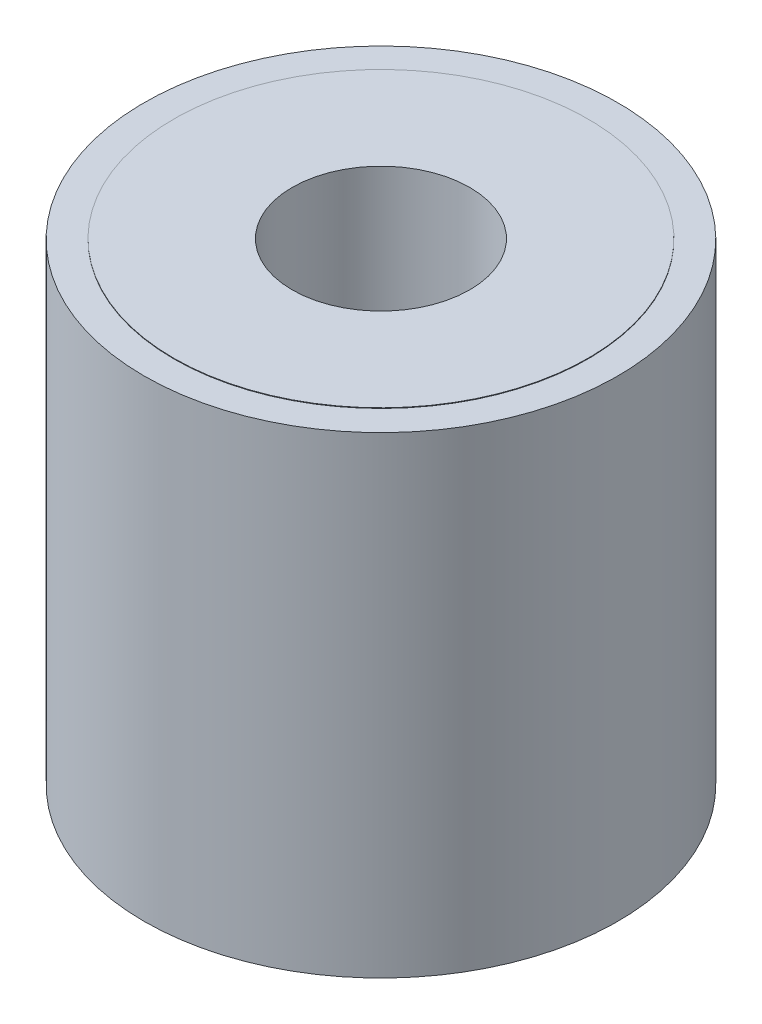
ISO-10303-21;
HEADER;
FILE_DESCRIPTION(('STEP AP214'),'2;1');
FILE_NAME('part.step','',(''),(''),'','','');
FILE_SCHEMA(('AUTOMOTIVE_DESIGN { 1 0 10303 214 1 1 1 1 }'));
ENDSEC;
DATA;
#1=APPLICATION_CONTEXT('core data for automotive mechanical design processes');
#2=APPLICATION_PROTOCOL_DEFINITION('international standard','automotive_design',2000,#1);
#3=PRODUCT_CONTEXT('',#1,'mechanical');
#4=PRODUCT('Part','Part','',(#3));
#5=PRODUCT_RELATED_PRODUCT_CATEGORY('part','',(#4));
#6=PRODUCT_DEFINITION_FORMATION('','',#4);
#7=PRODUCT_DEFINITION_CONTEXT('part definition',#1,'design');
#8=PRODUCT_DEFINITION('design','',#6,#7);
#9=PRODUCT_DEFINITION_SHAPE('','',#8);
#10=(LENGTH_UNIT() NAMED_UNIT(*) SI_UNIT(.MILLI.,.METRE.));
#11=(NAMED_UNIT(*) PLANE_ANGLE_UNIT() SI_UNIT($,.RADIAN.));
#12=(NAMED_UNIT(*) SI_UNIT($,.STERADIAN.) SOLID_ANGLE_UNIT());
#13=UNCERTAINTY_MEASURE_WITH_UNIT(LENGTH_MEASURE(1.E-05),#10,'distance_accuracy_value','');
#14=(GEOMETRIC_REPRESENTATION_CONTEXT(3) GLOBAL_UNCERTAINTY_ASSIGNED_CONTEXT((#13)) GLOBAL_UNIT_ASSIGNED_CONTEXT((#10,
#11,#12)) REPRESENTATION_CONTEXT('',''));
#15=CARTESIAN_POINT('',(0.,0.,0.));
#16=DIRECTION('',(0.,0.,1.));
#17=DIRECTION('',(1.,0.,0.));
#18=AXIS2_PLACEMENT_3D('',#15,#16,#17);
#19=CARTESIAN_POINT('',(0.,-1.,0.));
#20=DIRECTION('',(0.,-1.,0.));
#21=DIRECTION('',(0.,0.,-1.));
#22=AXIS2_PLACEMENT_3D('',#19,#20,#21);
#23=PLANE('',#22);
#24=CARTESIAN_POINT('',(0.,-1.,0.));
#25=DIRECTION('',(0.,1.,0.));
#26=DIRECTION('',(0.,0.,1.));
#27=AXIS2_PLACEMENT_3D('',#24,#25,#26);
#28=CIRCLE('',#27,1.5);
#29=CARTESIAN_POINT('',(0.,-1.,1.5));
#30=VERTEX_POINT('',#29);
#31=EDGE_CURVE('E10',#30,#30,#28,.T.);
#32=ORIENTED_EDGE('',*,*,#31,.F.);
#33=EDGE_LOOP('',(#32));
#34=FACE_BOUND('',#33,.T.);
#35=ADVANCED_FACE('F35',(#34),#23,.T.);
#36=CARTESIAN_POINT('',(0.,1.,0.));
#37=DIRECTION('',(0.,1.,0.));
#38=DIRECTION('',(0.,0.,1.));
#39=AXIS2_PLACEMENT_3D('',#36,#37,#38);
#40=CYLINDRICAL_SURFACE('',#39,1.5);
#41=ORIENTED_EDGE('',*,*,#31,.T.);
#42=EDGE_LOOP('',(#41));
#43=FACE_BOUND('',#42,.T.);
#44=CARTESIAN_POINT('',(0.,-4.,0.));
#45=DIRECTION('',(0.,1.,0.));
#46=DIRECTION('',(0.,0.,1.));
#47=AXIS2_PLACEMENT_3D('',#44,#45,#46);
#48=CIRCLE('',#47,1.5);
#49=CARTESIAN_POINT('',(0.,-4.,1.5));
#50=VERTEX_POINT('',#49);
#51=EDGE_CURVE('E41',#50,#50,#48,.T.);
#52=ORIENTED_EDGE('',*,*,#51,.F.);
#53=EDGE_LOOP('',(#52));
#54=FACE_BOUND('',#53,.T.);
#55=ADVANCED_FACE('F89',(#43,#54),#40,.F.);
#56=CARTESIAN_POINT('',(-1.5,-4.,0.));
#57=DIRECTION('',(0.,-1.,0.));
#58=DIRECTION('',(0.,0.,-1.));
#59=AXIS2_PLACEMENT_3D('',#56,#57,#58);
#60=PLANE('',#59);
#61=ORIENTED_EDGE('',*,*,#51,.T.);
#62=EDGE_LOOP('',(#61));
#63=FACE_BOUND('',#62,.T.);
#64=CARTESIAN_POINT('',(0.,-4.,0.));
#65=DIRECTION('',(0.,1.,0.));
#66=DIRECTION('',(0.,0.,1.));
#67=AXIS2_PLACEMENT_3D('',#64,#65,#66);
#68=CIRCLE('',#67,3.5);
#69=CARTESIAN_POINT('',(0.,-4.,3.5));
#70=VERTEX_POINT('',#69);
#71=EDGE_CURVE('E45',#70,#70,#68,.T.);
#72=ORIENTED_EDGE('',*,*,#71,.F.);
#73=EDGE_LOOP('',(#72));
#74=FACE_BOUND('',#73,.T.);
#75=ADVANCED_FACE('F94',(#63,#74),#60,.T.);
#76=CARTESIAN_POINT('',(0.,1.,0.));
#77=DIRECTION('',(0.,1.,0.));
#78=DIRECTION('',(0.,0.,1.));
#79=AXIS2_PLACEMENT_3D('',#76,#77,#78);
#80=CYLINDRICAL_SURFACE('',#79,3.5);
#81=ORIENTED_EDGE('',*,*,#71,.T.);
#82=EDGE_LOOP('',(#81));
#83=FACE_BOUND('',#82,.T.);
#84=CARTESIAN_POINT('',(0.,-3.99,0.));
#85=DIRECTION('',(0.,1.,0.));
#86=DIRECTION('',(0.,0.,1.));
#87=AXIS2_PLACEMENT_3D('',#84,#85,#86);
#88=CIRCLE('',#87,3.5);
#89=CARTESIAN_POINT('',(0.,-3.99,3.5));
#90=VERTEX_POINT('',#89);
#91=EDGE_CURVE('E49',#90,#90,#88,.T.);
#92=ORIENTED_EDGE('',*,*,#91,.F.);
#93=EDGE_LOOP('',(#92));
#94=FACE_BOUND('',#93,.T.);
#95=ADVANCED_FACE('F98',(#83,#94),#80,.T.);
#96=CARTESIAN_POINT('',(-3.5,-3.99,0.));
#97=DIRECTION('',(0.,-1.,0.));
#98=DIRECTION('',(0.,0.,-1.));
#99=AXIS2_PLACEMENT_3D('',#96,#97,#98);
#100=PLANE('',#99);
#101=ORIENTED_EDGE('',*,*,#91,.T.);
#102=EDGE_LOOP('',(#101));
#103=FACE_BOUND('',#102,.T.);
#104=CARTESIAN_POINT('',(0.,-3.99,0.));
#105=DIRECTION('',(0.,1.,0.));
#106=DIRECTION('',(0.,0.,1.));
#107=AXIS2_PLACEMENT_3D('',#104,#105,#106);
#108=CIRCLE('',#107,4.);
#109=CARTESIAN_POINT('',(0.,-3.99,4.));
#110=VERTEX_POINT('',#109);
#111=EDGE_CURVE('E54',#110,#110,#108,.T.);
#112=ORIENTED_EDGE('',*,*,#111,.F.);
#113=EDGE_LOOP('',(#112));
#114=FACE_BOUND('',#113,.T.);
#115=ADVANCED_FACE('F104',(#103,#114),#100,.T.);
#116=CARTESIAN_POINT('',(0.,1.,0.));
#117=DIRECTION('',(0.,1.,0.));
#118=DIRECTION('',(0.,0.,1.));
#119=AXIS2_PLACEMENT_3D('',#116,#117,#118);
#120=CYLINDRICAL_SURFACE('',#119,4.);
#121=ORIENTED_EDGE('',*,*,#111,.T.);
#122=EDGE_LOOP('',(#121));
#123=FACE_BOUND('',#122,.T.);
#124=CARTESIAN_POINT('',(0.,3.99,0.));
#125=DIRECTION('',(0.,1.,0.));
#126=DIRECTION('',(0.,0.,1.));
#127=AXIS2_PLACEMENT_3D('',#124,#125,#126);
#128=CIRCLE('',#127,4.);
#129=CARTESIAN_POINT('',(0.,3.99,4.));
#130=VERTEX_POINT('',#129);
#131=EDGE_CURVE('E57',#130,#130,#128,.T.);
#132=ORIENTED_EDGE('',*,*,#131,.F.);
#133=EDGE_LOOP('',(#132));
#134=FACE_BOUND('',#133,.T.);
#135=ADVANCED_FACE('F108',(#123,#134),#120,.T.);
#136=CARTESIAN_POINT('',(-4.,3.99,0.));
#137=DIRECTION('',(0.,1.,0.));
#138=DIRECTION('',(0.,0.,1.));
#139=AXIS2_PLACEMENT_3D('',#136,#137,#138);
#140=PLANE('',#139);
#141=ORIENTED_EDGE('',*,*,#131,.T.);
#142=EDGE_LOOP('',(#141));
#143=FACE_BOUND('',#142,.T.);
#144=CARTESIAN_POINT('',(0.,3.99,0.));
#145=DIRECTION('',(0.,1.,0.));
#146=DIRECTION('',(0.,0.,1.));
#147=AXIS2_PLACEMENT_3D('',#144,#145,#146);
#148=CIRCLE('',#147,3.5);
#149=CARTESIAN_POINT('',(0.,3.99,3.5));
#150=VERTEX_POINT('',#149);
#151=EDGE_CURVE('E60',#150,#150,#148,.T.);
#152=ORIENTED_EDGE('',*,*,#151,.F.);
#153=EDGE_LOOP('',(#152));
#154=FACE_BOUND('',#153,.T.);
#155=ADVANCED_FACE('F112',(#143,#154),#140,.T.);
#156=CARTESIAN_POINT('',(0.,1.,0.));
#157=DIRECTION('',(0.,1.,0.));
#158=DIRECTION('',(0.,0.,1.));
#159=AXIS2_PLACEMENT_3D('',#156,#157,#158);
#160=CYLINDRICAL_SURFACE('',#159,3.5);
#161=ORIENTED_EDGE('',*,*,#151,.T.);
#162=EDGE_LOOP('',(#161));
#163=FACE_BOUND('',#162,.T.);
#164=CARTESIAN_POINT('',(0.,4.,0.));
#165=DIRECTION('',(0.,1.,0.));
#166=DIRECTION('',(0.,0.,1.));
#167=AXIS2_PLACEMENT_3D('',#164,#165,#166);
#168=CIRCLE('',#167,3.5);
#169=CARTESIAN_POINT('',(0.,4.,3.5));
#170=VERTEX_POINT('',#169);
#171=EDGE_CURVE('E63',#170,#170,#168,.T.);
#172=ORIENTED_EDGE('',*,*,#171,.F.);
#173=EDGE_LOOP('',(#172));
#174=FACE_BOUND('',#173,.T.);
#175=ADVANCED_FACE('F85',(#163,#174),#160,.T.);
#176=CARTESIAN_POINT('',(-3.5,4.,0.));
#177=DIRECTION('',(0.,1.,0.));
#178=DIRECTION('',(0.,0.,1.));
#179=AXIS2_PLACEMENT_3D('',#176,#177,#178);
#180=PLANE('',#179);
#181=ORIENTED_EDGE('',*,*,#171,.T.);
#182=EDGE_LOOP('',(#181));
#183=FACE_BOUND('',#182,.T.);
#184=CARTESIAN_POINT('',(0.,4.,0.));
#185=DIRECTION('',(0.,1.,0.));
#186=DIRECTION('',(0.,0.,1.));
#187=AXIS2_PLACEMENT_3D('',#184,#185,#186);
#188=CIRCLE('',#187,1.5);
#189=CARTESIAN_POINT('',(0.,4.,1.5));
#190=VERTEX_POINT('',#189);
#191=EDGE_CURVE('E66',#190,#190,#188,.T.);
#192=ORIENTED_EDGE('',*,*,#191,.F.);
#193=EDGE_LOOP('',(#192));
#194=FACE_BOUND('',#193,.T.);
#195=ADVANCED_FACE('F77',(#183,#194),#180,.T.);
#196=CARTESIAN_POINT('',(0.,1.,0.));
#197=DIRECTION('',(0.,1.,0.));
#198=DIRECTION('',(0.,0.,1.));
#199=AXIS2_PLACEMENT_3D('',#196,#197,#198);
#200=CYLINDRICAL_SURFACE('',#199,1.5);
#201=ORIENTED_EDGE('',*,*,#191,.T.);
#202=EDGE_LOOP('',(#201));
#203=FACE_BOUND('',#202,.T.);
#204=CARTESIAN_POINT('',(0.,1.,0.));
#205=DIRECTION('',(0.,1.,0.));
#206=DIRECTION('',(0.,0.,1.));
#207=AXIS2_PLACEMENT_3D('',#204,#205,#206);
#208=CIRCLE('',#207,1.5);
#209=CARTESIAN_POINT('',(0.,1.,1.5));
#210=VERTEX_POINT('',#209);
#211=EDGE_CURVE('E69',#210,#210,#208,.T.);
#212=ORIENTED_EDGE('',*,*,#211,.F.);
#213=EDGE_LOOP('',(#212));
#214=FACE_BOUND('',#213,.T.);
#215=ADVANCED_FACE('F75',(#203,#214),#200,.F.);
#216=CARTESIAN_POINT('',(-1.5,1.,0.));
#217=DIRECTION('',(0.,1.,0.));
#218=DIRECTION('',(0.,0.,1.));
#219=AXIS2_PLACEMENT_3D('',#216,#217,#218);
#220=PLANE('',#219);
#221=ORIENTED_EDGE('',*,*,#211,.T.);
#222=EDGE_LOOP('',(#221));
#223=FACE_BOUND('',#222,.T.);
#224=ADVANCED_FACE('F73',(#223),#220,.T.);
#225=CLOSED_SHELL('',(#35,#55,#75,#95,#115,#135,#155,#175,#195,#215,#224));
#226=MANIFOLD_SOLID_BREP('B2',#225);
#227=ADVANCED_BREP_SHAPE_REPRESENTATION('',(#18,#226),#14);
#228=SHAPE_DEFINITION_REPRESENTATION(#9,#227);
ENDSEC;
END-ISO-10303-21;
